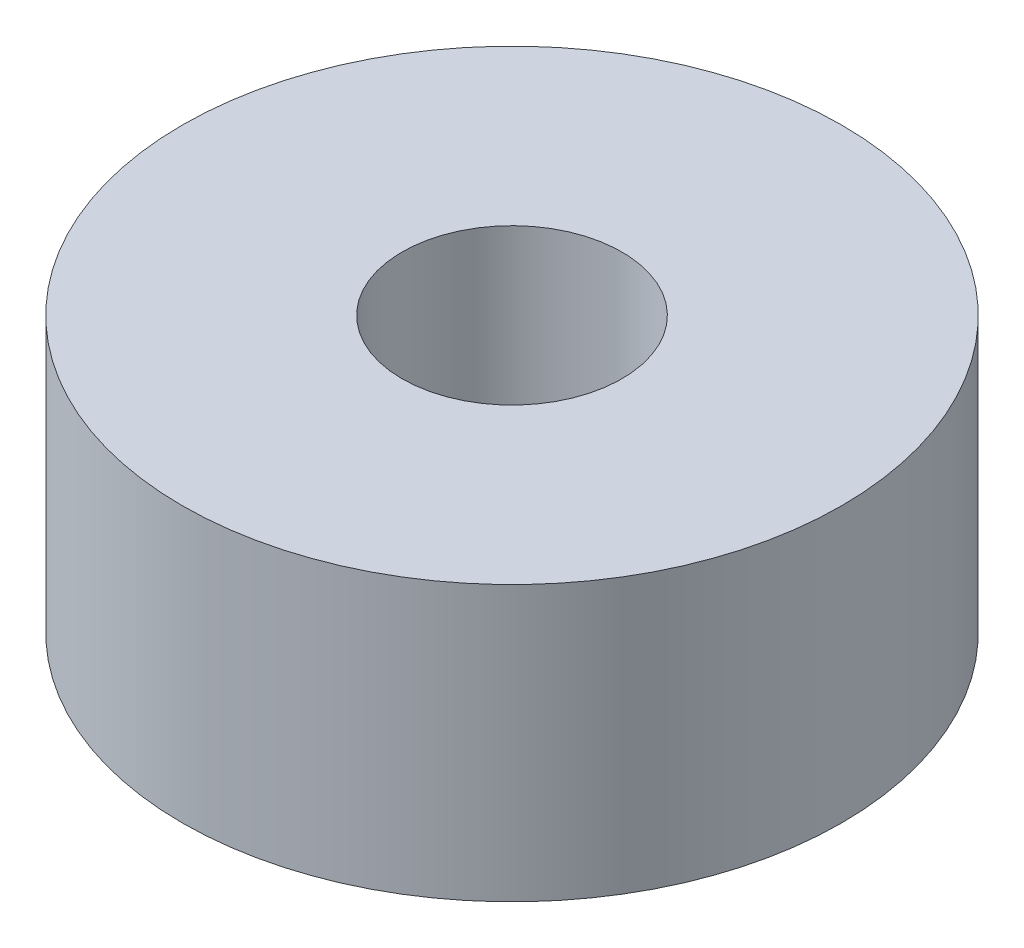
ISO-10303-21;
HEADER;
FILE_DESCRIPTION(('STEP AP214'),'2;1');
FILE_NAME('part.step','',(''),(''),'','','');
FILE_SCHEMA(('AUTOMOTIVE_DESIGN { 1 0 10303 214 1 1 1 1 }'));
ENDSEC;
DATA;
#1=APPLICATION_CONTEXT('core data for automotive mechanical design processes');
#2=APPLICATION_PROTOCOL_DEFINITION('international standard','automotive_design',2000,#1);
#3=PRODUCT_CONTEXT('',#1,'mechanical');
#4=PRODUCT('Part','Part','',(#3));
#5=PRODUCT_RELATED_PRODUCT_CATEGORY('part','',(#4));
#6=PRODUCT_DEFINITION_FORMATION('','',#4);
#7=PRODUCT_DEFINITION_CONTEXT('part definition',#1,'design');
#8=PRODUCT_DEFINITION('design','',#6,#7);
#9=PRODUCT_DEFINITION_SHAPE('','',#8);
#10=(LENGTH_UNIT() NAMED_UNIT(*) SI_UNIT(.MILLI.,.METRE.));
#11=(NAMED_UNIT(*) PLANE_ANGLE_UNIT() SI_UNIT($,.RADIAN.));
#12=(NAMED_UNIT(*) SI_UNIT($,.STERADIAN.) SOLID_ANGLE_UNIT());
#13=UNCERTAINTY_MEASURE_WITH_UNIT(LENGTH_MEASURE(1.E-05),#10,'distance_accuracy_value','');
#14=(GEOMETRIC_REPRESENTATION_CONTEXT(3) GLOBAL_UNCERTAINTY_ASSIGNED_CONTEXT((#13)) GLOBAL_UNIT_ASSIGNED_CONTEXT((#10,
#11,#12)) REPRESENTATION_CONTEXT('',''));
#15=CARTESIAN_POINT('',(0.,0.,0.));
#16=DIRECTION('',(0.,0.,1.));
#17=DIRECTION('',(1.,0.,0.));
#18=AXIS2_PLACEMENT_3D('',#15,#16,#17);
#19=CARTESIAN_POINT('',(0.,2.5,0.));
#20=DIRECTION('',(0.,1.,0.));
#21=DIRECTION('',(0.,0.,1.));
#22=AXIS2_PLACEMENT_3D('',#19,#20,#21);
#23=PLANE('',#22);
#24=CARTESIAN_POINT('',(0.,2.5,0.));
#25=DIRECTION('',(0.,1.,0.));
#26=DIRECTION('',(0.,0.,1.));
#27=AXIS2_PLACEMENT_3D('',#24,#25,#26);
#28=CIRCLE('',#27,3.);
#29=CARTESIAN_POINT('',(0.,2.5,3.));
#30=VERTEX_POINT('',#29);
#31=EDGE_CURVE('E10',#30,#30,#28,.T.);
#32=ORIENTED_EDGE('',*,*,#31,.T.);
#33=EDGE_LOOP('',(#32));
#34=FACE_BOUND('',#33,.T.);
#35=CARTESIAN_POINT('',(0.,2.5,0.));
#36=DIRECTION('',(0.,1.,0.));
#37=DIRECTION('',(0.,0.,1.));
#38=AXIS2_PLACEMENT_3D('',#35,#36,#37);
#39=CIRCLE('',#38,1.);
#40=CARTESIAN_POINT('',(0.,2.5,1.));
#41=VERTEX_POINT('',#40);
#42=EDGE_CURVE('E56',#41,#41,#39,.T.);
#43=ORIENTED_EDGE('',*,*,#42,.F.);
#44=EDGE_LOOP('',(#43));
#45=FACE_BOUND('',#44,.T.);
#46=ADVANCED_FACE('F43',(#34,#45),#23,.T.);
#47=CARTESIAN_POINT('',(0.,0.,0.));
#48=DIRECTION('',(0.,1.,0.));
#49=DIRECTION('',(0.,0.,1.));
#50=AXIS2_PLACEMENT_3D('',#47,#48,#49);
#51=PLANE('',#50);
#52=CARTESIAN_POINT('',(0.,0.,0.));
#53=DIRECTION('',(0.,1.,0.));
#54=DIRECTION('',(0.,0.,1.));
#55=AXIS2_PLACEMENT_3D('',#52,#53,#54);
#56=CIRCLE('',#55,3.);
#57=CARTESIAN_POINT('',(0.,0.,3.));
#58=VERTEX_POINT('',#57);
#59=EDGE_CURVE('E47',#58,#58,#56,.T.);
#60=ORIENTED_EDGE('',*,*,#59,.F.);
#61=EDGE_LOOP('',(#60));
#62=FACE_BOUND('',#61,.T.);
#63=CARTESIAN_POINT('',(0.,0.,0.));
#64=DIRECTION('',(0.,1.,0.));
#65=DIRECTION('',(0.,0.,1.));
#66=AXIS2_PLACEMENT_3D('',#63,#64,#65);
#67=CIRCLE('',#66,1.);
#68=CARTESIAN_POINT('',(0.,0.,1.));
#69=VERTEX_POINT('',#68);
#70=EDGE_CURVE('E58',#69,#69,#67,.T.);
#71=ORIENTED_EDGE('',*,*,#70,.T.);
#72=EDGE_LOOP('',(#71));
#73=FACE_BOUND('',#72,.T.);
#74=ADVANCED_FACE('F70',(#62,#73),#51,.F.);
#75=CARTESIAN_POINT('',(0.,2.5,0.));
#76=DIRECTION('',(0.,-1.,0.));
#77=DIRECTION('',(0.,0.,-1.));
#78=AXIS2_PLACEMENT_3D('',#75,#76,#77);
#79=CYLINDRICAL_SURFACE('',#78,3.);
#80=ORIENTED_EDGE('',*,*,#31,.F.);
#81=EDGE_LOOP('',(#80));
#82=FACE_BOUND('',#81,.T.);
#83=ORIENTED_EDGE('',*,*,#59,.T.);
#84=EDGE_LOOP('',(#83));
#85=FACE_BOUND('',#84,.T.);
#86=ADVANCED_FACE('F45',(#82,#85),#79,.T.);
#87=CARTESIAN_POINT('',(0.,2.5,0.));
#88=DIRECTION('',(0.,-1.,0.));
#89=DIRECTION('',(0.,0.,-1.));
#90=AXIS2_PLACEMENT_3D('',#87,#88,#89);
#91=CYLINDRICAL_SURFACE('',#90,1.);
#92=ORIENTED_EDGE('',*,*,#42,.T.);
#93=EDGE_LOOP('',(#92));
#94=FACE_BOUND('',#93,.T.);
#95=ORIENTED_EDGE('',*,*,#70,.F.);
#96=EDGE_LOOP('',(#95));
#97=FACE_BOUND('',#96,.T.);
#98=ADVANCED_FACE('F66',(#94,#97),#91,.F.);
#99=CLOSED_SHELL('',(#46,#74,#86,#98));
#100=MANIFOLD_SOLID_BREP('B2',#99);
#101=ADVANCED_BREP_SHAPE_REPRESENTATION('',(#18,#100),#14);
#102=SHAPE_DEFINITION_REPRESENTATION(#9,#101);
ENDSEC;
END-ISO-10303-21;
